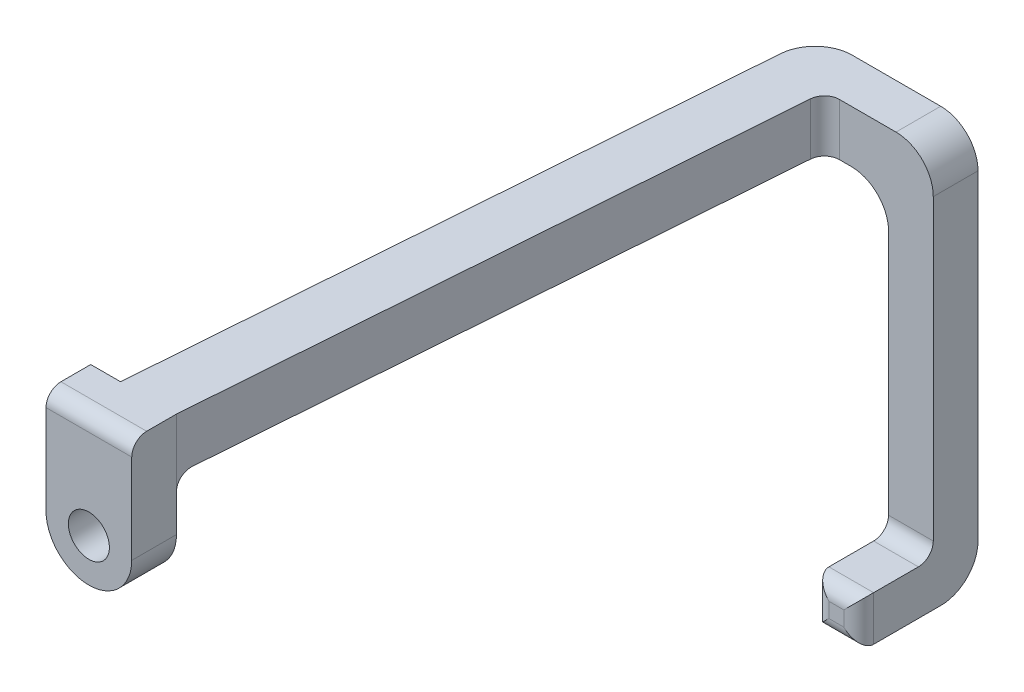
ISO-10303-21;
HEADER;
FILE_DESCRIPTION(('STEP AP214'),'2;1');
FILE_NAME('part.step','',(''),(''),'','','');
FILE_SCHEMA(('AUTOMOTIVE_DESIGN { 1 0 10303 214 1 1 1 1 }'));
ENDSEC;
DATA;
#1=APPLICATION_CONTEXT('core data for automotive mechanical design processes');
#2=APPLICATION_PROTOCOL_DEFINITION('international standard','automotive_design',2000,#1);
#3=PRODUCT_CONTEXT('',#1,'mechanical');
#4=PRODUCT('Part','Part','',(#3));
#5=PRODUCT_RELATED_PRODUCT_CATEGORY('part','',(#4));
#6=PRODUCT_DEFINITION_FORMATION('','',#4);
#7=PRODUCT_DEFINITION_CONTEXT('part definition',#1,'design');
#8=PRODUCT_DEFINITION('design','',#6,#7);
#9=PRODUCT_DEFINITION_SHAPE('','',#8);
#10=(LENGTH_UNIT() NAMED_UNIT(*) SI_UNIT(.MILLI.,.METRE.));
#11=(NAMED_UNIT(*) PLANE_ANGLE_UNIT() SI_UNIT($,.RADIAN.));
#12=(NAMED_UNIT(*) SI_UNIT($,.STERADIAN.) SOLID_ANGLE_UNIT());
#13=UNCERTAINTY_MEASURE_WITH_UNIT(LENGTH_MEASURE(1.E-05),#10,'distance_accuracy_value','');
#14=(GEOMETRIC_REPRESENTATION_CONTEXT(3) GLOBAL_UNCERTAINTY_ASSIGNED_CONTEXT((#13)) GLOBAL_UNIT_ASSIGNED_CONTEXT((#10,
#11,#12)) REPRESENTATION_CONTEXT('',''));
#15=CARTESIAN_POINT('',(0.,0.,0.));
#16=DIRECTION('',(0.,0.,1.));
#17=DIRECTION('',(1.,0.,0.));
#18=AXIS2_PLACEMENT_3D('',#15,#16,#17);
#19=CARTESIAN_POINT('',(1.39673484487678,7.,-40.5));
#20=DIRECTION('',(0.,0.,1.));
#21=DIRECTION('',(1.,0.,0.));
#22=AXIS2_PLACEMENT_3D('',#19,#20,#21);
#23=PLANE('',#22);
#24=DIRECTION('',(1.,0.,0.));
#25=VECTOR('',#24,1.);
#26=CARTESIAN_POINT('',(1.39673484487678,7.,-40.5));
#27=LINE('',#26,#25);
#28=CARTESIAN_POINT('',(6.82893653087128,7.,-40.5));
#29=VERTEX_POINT('',#28);
#30=CARTESIAN_POINT('',(10.625,7.,-40.5));
#31=VERTEX_POINT('',#30);
#32=EDGE_CURVE('E218',#29,#31,#27,.T.);
#33=ORIENTED_EDGE('',*,*,#32,.F.);
#34=DIRECTION('',(0.,-1.,0.));
#35=VECTOR('',#34,1.);
#36=CARTESIAN_POINT('',(6.82893653087128,7.,-40.5));
#37=LINE('',#36,#35);
#38=CARTESIAN_POINT('',(6.82893653087128,3.5,-40.5));
#39=VERTEX_POINT('',#38);
#40=EDGE_CURVE('E371',#29,#39,#37,.T.);
#41=ORIENTED_EDGE('',*,*,#40,.T.);
#42=DIRECTION('',(1.,0.,0.));
#43=VECTOR('',#42,1.);
#44=CARTESIAN_POINT('',(1.39673484487678,3.5,-40.5));
#45=LINE('',#44,#43);
#46=CARTESIAN_POINT('',(7.625,3.5,-40.5));
#47=VERTEX_POINT('',#46);
#48=EDGE_CURVE('E375',#39,#47,#45,.T.);
#49=ORIENTED_EDGE('',*,*,#48,.T.);
#50=CARTESIAN_POINT('',(7.625,0.999999999999999,-40.5));
#51=DIRECTION('',(0.,0.,1.));
#52=DIRECTION('',(1.,0.,0.));
#53=AXIS2_PLACEMENT_3D('',#50,#51,#52);
#54=CIRCLE('',#53,2.5);
#55=CARTESIAN_POINT('',(10.125,0.999999999999997,-40.5));
#56=VERTEX_POINT('',#55);
#57=EDGE_CURVE('E525',#47,#56,#54,.F.);
#58=ORIENTED_EDGE('',*,*,#57,.T.);
#59=DIRECTION('',(0.,1.,0.));
#60=VECTOR('',#59,1.);
#61=CARTESIAN_POINT('',(10.125,-19.5,-40.5));
#62=LINE('',#61,#60);
#63=CARTESIAN_POINT('',(10.125,-15.5,-40.5));
#64=VERTEX_POINT('',#63);
#65=EDGE_CURVE('E471',#64,#56,#62,.T.);
#66=ORIENTED_EDGE('',*,*,#65,.F.);
#67=DIRECTION('',(-1.,0.,0.));
#68=VECTOR('',#67,1.);
#69=CARTESIAN_POINT('',(1.39673484487678,-15.5,-40.5));
#70=LINE('',#69,#68);
#71=CARTESIAN_POINT('',(13.125,-15.5,-40.5));
#72=VERTEX_POINT('',#71);
#73=EDGE_CURVE('E383',#64,#72,#70,.F.);
#74=ORIENTED_EDGE('',*,*,#73,.T.);
#75=DIRECTION('',(0.,-1.,0.));
#76=VECTOR('',#75,1.);
#77=CARTESIAN_POINT('',(13.125,7.,-40.5));
#78=LINE('',#77,#76);
#79=CARTESIAN_POINT('',(13.125,4.5,-40.5));
#80=VERTEX_POINT('',#79);
#81=EDGE_CURVE('E478',#80,#72,#78,.T.);
#82=ORIENTED_EDGE('',*,*,#81,.F.);
#83=CARTESIAN_POINT('',(10.625,4.5,-40.5));
#84=DIRECTION('',(0.,0.,1.));
#85=DIRECTION('',(1.,0.,0.));
#86=AXIS2_PLACEMENT_3D('',#83,#84,#85);
#87=CIRCLE('',#86,2.5);
#88=EDGE_CURVE('E374',#80,#31,#87,.T.);
#89=ORIENTED_EDGE('',*,*,#88,.T.);
#90=EDGE_LOOP('',(#33,#41,#49,#58,#66,#74,#82,#89));
#91=FACE_BOUND('',#90,.T.);
#92=ADVANCED_FACE('F47',(#91),#23,.T.);
#93=CARTESIAN_POINT('',(0.,0.,3.));
#94=DIRECTION('',(0.,0.,1.));
#95=DIRECTION('',(1.,0.,0.));
#96=AXIS2_PLACEMENT_3D('',#93,#94,#95);
#97=PLANE('',#96);
#98=DIRECTION('',(0.,1.,0.));
#99=VECTOR('',#98,1.);
#100=CARTESIAN_POINT('',(2.875,0.,3.));
#101=LINE('',#100,#99);
#102=CARTESIAN_POINT('',(2.875,0.,3.));
#103=VERTEX_POINT('',#102);
#104=CARTESIAN_POINT('',(2.875,6.,3.));
#105=VERTEX_POINT('',#104);
#106=EDGE_CURVE('E276',#103,#105,#101,.T.);
#107=ORIENTED_EDGE('',*,*,#106,.T.);
#108=DIRECTION('',(-1.,0.,0.));
#109=VECTOR('',#108,1.);
#110=CARTESIAN_POINT('',(-2.875,6.,3.));
#111=LINE('',#110,#109);
#112=CARTESIAN_POINT('',(-2.875,6.,3.));
#113=VERTEX_POINT('',#112);
#114=EDGE_CURVE('E385',#105,#113,#111,.T.);
#115=ORIENTED_EDGE('',*,*,#114,.T.);
#116=DIRECTION('',(0.,-1.,0.));
#117=VECTOR('',#116,1.);
#118=CARTESIAN_POINT('',(-2.875,0.,3.));
#119=LINE('',#118,#117);
#120=CARTESIAN_POINT('',(-2.875,0.,3.));
#121=VERTEX_POINT('',#120);
#122=EDGE_CURVE('E280',#113,#121,#119,.T.);
#123=ORIENTED_EDGE('',*,*,#122,.T.);
#124=CARTESIAN_POINT('',(0.,0.,3.));
#125=DIRECTION('',(0.,0.,1.));
#126=DIRECTION('',(1.,0.,0.));
#127=AXIS2_PLACEMENT_3D('',#124,#125,#126);
#128=CIRCLE('',#127,2.875);
#129=EDGE_CURVE('E273',#121,#103,#128,.T.);
#130=ORIENTED_EDGE('',*,*,#129,.T.);
#131=EDGE_LOOP('',(#107,#115,#123,#130));
#132=FACE_BOUND('',#131,.T.);
#133=CARTESIAN_POINT('',(0.,0.,3.));
#134=DIRECTION('',(0.,0.,1.));
#135=DIRECTION('',(1.,0.,0.));
#136=AXIS2_PLACEMENT_3D('',#133,#134,#135);
#137=CIRCLE('',#136,1.375);
#138=CARTESIAN_POINT('',(1.375,0.,3.));
#139=VERTEX_POINT('',#138);
#140=EDGE_CURVE('E262',#139,#139,#137,.T.);
#141=ORIENTED_EDGE('',*,*,#140,.F.);
#142=EDGE_LOOP('',(#141));
#143=FACE_BOUND('',#142,.T.);
#144=ADVANCED_FACE('F359',(#132,#143),#97,.T.);
#145=CARTESIAN_POINT('',(0.,0.,0.));
#146=DIRECTION('',(0.,0.,1.));
#147=DIRECTION('',(1.,0.,0.));
#148=AXIS2_PLACEMENT_3D('',#145,#146,#147);
#149=PLANE('',#148);
#150=DIRECTION('',(0.,1.,0.));
#151=VECTOR('',#150,1.);
#152=CARTESIAN_POINT('',(-0.875,7.,0.));
#153=LINE('',#152,#151);
#154=CARTESIAN_POINT('',(-0.875,2.5,0.));
#155=VERTEX_POINT('',#154);
#156=CARTESIAN_POINT('',(-0.875,7.,0.));
#157=VERTEX_POINT('',#156);
#158=EDGE_CURVE('E65',#155,#157,#153,.T.);
#159=ORIENTED_EDGE('',*,*,#158,.F.);
#160=DIRECTION('',(-1.,0.,0.));
#161=VECTOR('',#160,1.);
#162=CARTESIAN_POINT('',(2.875,2.5,0.));
#163=LINE('',#162,#161);
#164=CARTESIAN_POINT('',(2.875,2.5,0.));
#165=VERTEX_POINT('',#164);
#166=EDGE_CURVE('E422',#155,#165,#163,.F.);
#167=ORIENTED_EDGE('',*,*,#166,.T.);
#168=DIRECTION('',(0.,1.,0.));
#169=VECTOR('',#168,1.);
#170=CARTESIAN_POINT('',(2.875,0.,0.));
#171=LINE('',#170,#169);
#172=CARTESIAN_POINT('',(2.875,0.,0.));
#173=VERTEX_POINT('',#172);
#174=EDGE_CURVE('E285',#173,#165,#171,.T.);
#175=ORIENTED_EDGE('',*,*,#174,.F.);
#176=CARTESIAN_POINT('',(0.,0.,0.));
#177=DIRECTION('',(0.,0.,1.));
#178=DIRECTION('',(1.,0.,0.));
#179=AXIS2_PLACEMENT_3D('',#176,#177,#178);
#180=CIRCLE('',#179,2.875);
#181=CARTESIAN_POINT('',(-2.875,0.,0.));
#182=VERTEX_POINT('',#181);
#183=EDGE_CURVE('E270',#182,#173,#180,.T.);
#184=ORIENTED_EDGE('',*,*,#183,.F.);
#185=DIRECTION('',(0.,-1.,0.));
#186=VECTOR('',#185,1.);
#187=CARTESIAN_POINT('',(-2.875,0.,0.));
#188=LINE('',#187,#186);
#189=CARTESIAN_POINT('',(-2.875,7.,0.));
#190=VERTEX_POINT('',#189);
#191=EDGE_CURVE('E277',#190,#182,#188,.T.);
#192=ORIENTED_EDGE('',*,*,#191,.F.);
#193=DIRECTION('',(-1.,0.,0.));
#194=VECTOR('',#193,1.);
#195=CARTESIAN_POINT('',(2.875,7.,0.));
#196=LINE('',#195,#194);
#197=EDGE_CURVE('E294',#157,#190,#196,.T.);
#198=ORIENTED_EDGE('',*,*,#197,.F.);
#199=EDGE_LOOP('',(#159,#167,#175,#184,#192,#198));
#200=FACE_BOUND('',#199,.T.);
#201=CARTESIAN_POINT('',(0.,0.,0.));
#202=DIRECTION('',(0.,0.,1.));
#203=DIRECTION('',(1.,0.,0.));
#204=AXIS2_PLACEMENT_3D('',#201,#202,#203);
#205=CIRCLE('',#204,1.375);
#206=CARTESIAN_POINT('',(1.375,0.,0.));
#207=VERTEX_POINT('',#206);
#208=EDGE_CURVE('E228',#207,#207,#205,.T.);
#209=ORIENTED_EDGE('',*,*,#208,.T.);
#210=EDGE_LOOP('',(#209));
#211=FACE_BOUND('',#210,.T.);
#212=ADVANCED_FACE('F365',(#200,#211),#149,.F.);
#213=CARTESIAN_POINT('',(0.,0.,3.));
#214=DIRECTION('',(0.,0.,-1.));
#215=DIRECTION('',(-1.,0.,0.));
#216=AXIS2_PLACEMENT_3D('',#213,#214,#215);
#217=CYLINDRICAL_SURFACE('',#216,2.875);
#218=ORIENTED_EDGE('',*,*,#183,.T.);
#219=DIRECTION('',(0.,0.,-1.));
#220=VECTOR('',#219,1.);
#221=CARTESIAN_POINT('',(2.875,0.,3.));
#222=LINE('',#221,#220);
#223=EDGE_CURVE('E303',#103,#173,#222,.T.);
#224=ORIENTED_EDGE('',*,*,#223,.F.);
#225=ORIENTED_EDGE('',*,*,#129,.F.);
#226=DIRECTION('',(0.,0.,-1.));
#227=VECTOR('',#226,1.);
#228=CARTESIAN_POINT('',(-2.875,0.,3.));
#229=LINE('',#228,#227);
#230=EDGE_CURVE('E282',#121,#182,#229,.T.);
#231=ORIENTED_EDGE('',*,*,#230,.T.);
#232=EDGE_LOOP('',(#218,#224,#225,#231));
#233=FACE_BOUND('',#232,.T.);
#234=ADVANCED_FACE('F415',(#233),#217,.T.);
#235=CARTESIAN_POINT('',(2.875,0.,3.));
#236=DIRECTION('',(-1.,0.,0.));
#237=DIRECTION('',(0.,-1.,0.));
#238=AXIS2_PLACEMENT_3D('',#235,#236,#237);
#239=PLANE('',#238);
#240=DIRECTION('',(0.,0.,-1.));
#241=VECTOR('',#240,1.);
#242=CARTESIAN_POINT('',(2.875,7.,3.));
#243=LINE('',#242,#241);
#244=CARTESIAN_POINT('',(2.875,7.,2.));
#245=VERTEX_POINT('',#244);
#246=CARTESIAN_POINT('',(2.875,7.,0.));
#247=VERTEX_POINT('',#246);
#248=EDGE_CURVE('E300',#245,#247,#243,.T.);
#249=ORIENTED_EDGE('',*,*,#248,.F.);
#250=CARTESIAN_POINT('',(2.875,6.,2.));
#251=DIRECTION('',(-1.,0.,0.));
#252=DIRECTION('',(0.,-1.,0.));
#253=AXIS2_PLACEMENT_3D('',#250,#251,#252);
#254=CIRCLE('',#253,1.);
#255=EDGE_CURVE('E309',#245,#105,#254,.F.);
#256=ORIENTED_EDGE('',*,*,#255,.T.);
#257=ORIENTED_EDGE('',*,*,#106,.F.);
#258=ORIENTED_EDGE('',*,*,#223,.T.);
#259=ORIENTED_EDGE('',*,*,#174,.T.);
#260=DIRECTION('',(0.,-1.,0.));
#261=VECTOR('',#260,1.);
#262=CARTESIAN_POINT('',(2.875,3.5,0.));
#263=LINE('',#262,#261);
#264=EDGE_CURVE('E425',#247,#165,#263,.T.);
#265=ORIENTED_EDGE('',*,*,#264,.F.);
#266=EDGE_LOOP('',(#249,#256,#257,#258,#259,#265));
#267=FACE_BOUND('',#266,.T.);
#268=ADVANCED_FACE('F407',(#267),#239,.F.);
#269=CARTESIAN_POINT('',(2.875,7.,3.));
#270=DIRECTION('',(0.,-1.,0.));
#271=DIRECTION('',(0.,0.,-1.));
#272=AXIS2_PLACEMENT_3D('',#269,#270,#271);
#273=PLANE('',#272);
#274=DIRECTION('',(0.,0.,-1.));
#275=VECTOR('',#274,1.);
#276=CARTESIAN_POINT('',(-2.875,7.,3.));
#277=LINE('',#276,#275);
#278=CARTESIAN_POINT('',(-2.875,7.,2.));
#279=VERTEX_POINT('',#278);
#280=EDGE_CURVE('E304',#279,#190,#277,.T.);
#281=ORIENTED_EDGE('',*,*,#280,.F.);
#282=DIRECTION('',(-1.,0.,0.));
#283=VECTOR('',#282,1.);
#284=CARTESIAN_POINT('',(2.875,7.,2.));
#285=LINE('',#284,#283);
#286=EDGE_CURVE('E307',#279,#245,#285,.F.);
#287=ORIENTED_EDGE('',*,*,#286,.T.);
#288=ORIENTED_EDGE('',*,*,#248,.T.);
#289=DIRECTION('',(0.0745049904033776,0.,-0.99722064078367));
#290=VECTOR('',#289,1.);
#291=CARTESIAN_POINT('',(2.875,7.,0.));
#292=LINE('',#291,#290);
#293=CARTESIAN_POINT('',(5.83171589008761,7.,-39.5745049904034));
#294=VERTEX_POINT('',#293);
#295=EDGE_CURVE('E325',#247,#294,#292,.T.);
#296=ORIENTED_EDGE('',*,*,#295,.T.);
#297=CARTESIAN_POINT('',(6.82893653087128,7.,-39.5));
#298=DIRECTION('',(0.,-1.,0.));
#299=DIRECTION('',(0.,0.,-1.));
#300=AXIS2_PLACEMENT_3D('',#297,#298,#299);
#301=CIRCLE('',#300,1.);
#302=EDGE_CURVE('E380',#294,#29,#301,.T.);
#303=ORIENTED_EDGE('',*,*,#302,.T.);
#304=ORIENTED_EDGE('',*,*,#32,.T.);
#305=DIRECTION('',(0.,0.,1.));
#306=VECTOR('',#305,1.);
#307=CARTESIAN_POINT('',(10.625,7.,-43.5));
#308=LINE('',#307,#306);
#309=CARTESIAN_POINT('',(10.625,7.,-43.5));
#310=VERTEX_POINT('',#309);
#311=EDGE_CURVE('E215',#31,#310,#308,.F.);
#312=ORIENTED_EDGE('',*,*,#311,.T.);
#313=DIRECTION('',(-1.,0.,0.));
#314=VECTOR('',#313,1.);
#315=CARTESIAN_POINT('',(13.125,7.,-43.5));
#316=LINE('',#315,#314);
#317=CARTESIAN_POINT('',(6.125,7.,-43.5));
#318=VERTEX_POINT('',#317);
#319=EDGE_CURVE('E208',#310,#318,#316,.T.);
#320=ORIENTED_EDGE('',*,*,#319,.T.);
#321=DIRECTION('',(1.,0.,0.));
#322=VECTOR('',#321,1.);
#323=CARTESIAN_POINT('',(6.125,7.,-43.5));
#324=LINE('',#323,#322);
#325=CARTESIAN_POINT('',(4.6951861547644,7.,-43.5));
#326=VERTEX_POINT('',#325);
#327=EDGE_CURVE('E212',#326,#318,#324,.T.);
#328=ORIENTED_EDGE('',*,*,#327,.F.);
#329=CARTESIAN_POINT('',(4.6951861547644,7.,-41.));
#330=DIRECTION('',(0.,-1.,0.));
#331=DIRECTION('',(0.,0.,-1.));
#332=AXIS2_PLACEMENT_3D('',#329,#330,#331);
#333=CIRCLE('',#332,2.5);
#334=CARTESIAN_POINT('',(2.20213455280523,7.,-41.1862624760084));
#335=VERTEX_POINT('',#334);
#336=EDGE_CURVE('E511',#326,#335,#333,.F.);
#337=ORIENTED_EDGE('',*,*,#336,.T.);
#338=DIRECTION('',(0.0745049904033776,0.,-0.99722064078367));
#339=VECTOR('',#338,1.);
#340=CARTESIAN_POINT('',(-0.875,7.,0.));
#341=LINE('',#340,#339);
#342=EDGE_CURVE('E322',#157,#335,#341,.T.);
#343=ORIENTED_EDGE('',*,*,#342,.F.);
#344=ORIENTED_EDGE('',*,*,#197,.T.);
#345=EDGE_LOOP('',(#281,#287,#288,#296,#303,#304,#312,#320,#328,#337,#343,#344));
#346=FACE_BOUND('',#345,.T.);
#347=ADVANCED_FACE('F211',(#346),#273,.F.);
#348=CARTESIAN_POINT('',(-2.875,0.,3.));
#349=DIRECTION('',(1.,0.,0.));
#350=DIRECTION('',(0.,1.,0.));
#351=AXIS2_PLACEMENT_3D('',#348,#349,#350);
#352=PLANE('',#351);
#353=ORIENTED_EDGE('',*,*,#122,.F.);
#354=CARTESIAN_POINT('',(-2.875,6.,2.));
#355=DIRECTION('',(1.,0.,0.));
#356=DIRECTION('',(0.,1.,0.));
#357=AXIS2_PLACEMENT_3D('',#354,#355,#356);
#358=CIRCLE('',#357,1.);
#359=EDGE_CURVE('E305',#113,#279,#358,.F.);
#360=ORIENTED_EDGE('',*,*,#359,.T.);
#361=ORIENTED_EDGE('',*,*,#280,.T.);
#362=ORIENTED_EDGE('',*,*,#191,.T.);
#363=ORIENTED_EDGE('',*,*,#230,.F.);
#364=EDGE_LOOP('',(#353,#360,#361,#362,#363));
#365=FACE_BOUND('',#364,.T.);
#366=ADVANCED_FACE('F395',(#365),#352,.F.);
#367=CARTESIAN_POINT('',(0.,0.,3.));
#368=DIRECTION('',(0.,0.,-1.));
#369=DIRECTION('',(-1.,0.,0.));
#370=AXIS2_PLACEMENT_3D('',#367,#368,#369);
#371=CYLINDRICAL_SURFACE('',#370,1.375);
#372=ORIENTED_EDGE('',*,*,#140,.T.);
#373=EDGE_LOOP('',(#372));
#374=FACE_BOUND('',#373,.T.);
#375=ORIENTED_EDGE('',*,*,#208,.F.);
#376=EDGE_LOOP('',(#375));
#377=FACE_BOUND('',#376,.T.);
#378=ADVANCED_FACE('F254',(#374,#377),#371,.F.);
#379=CARTESIAN_POINT('',(0.,0.,-43.5));
#380=DIRECTION('',(0.,0.,1.));
#381=DIRECTION('',(1.,0.,0.));
#382=AXIS2_PLACEMENT_3D('',#379,#380,#381);
#383=PLANE('',#382);
#384=DIRECTION('',(0.,1.,0.));
#385=VECTOR('',#384,1.);
#386=CARTESIAN_POINT('',(13.125,7.,-43.5));
#387=LINE('',#386,#385);
#388=CARTESIAN_POINT('',(13.125,-17.,-43.5));
#389=VERTEX_POINT('',#388);
#390=CARTESIAN_POINT('',(13.125,4.5,-43.5));
#391=VERTEX_POINT('',#390);
#392=EDGE_CURVE('E473',#389,#391,#387,.T.);
#393=ORIENTED_EDGE('',*,*,#392,.F.);
#394=DIRECTION('',(-1.,0.,0.));
#395=VECTOR('',#394,1.);
#396=CARTESIAN_POINT('',(0.,-17.,-43.5));
#397=LINE('',#396,#395);
#398=CARTESIAN_POINT('',(10.125,-17.,-43.5));
#399=VERTEX_POINT('',#398);
#400=EDGE_CURVE('E493',#389,#399,#397,.T.);
#401=ORIENTED_EDGE('',*,*,#400,.T.);
#402=DIRECTION('',(0.,1.,0.));
#403=VECTOR('',#402,1.);
#404=CARTESIAN_POINT('',(10.125,-19.5,-43.5));
#405=LINE('',#404,#403);
#406=CARTESIAN_POINT('',(10.125,0.999999999999997,-43.5));
#407=VERTEX_POINT('',#406);
#408=EDGE_CURVE('E470',#399,#407,#405,.T.);
#409=ORIENTED_EDGE('',*,*,#408,.T.);
#410=CARTESIAN_POINT('',(7.625,0.999999999999999,-43.5));
#411=DIRECTION('',(0.,0.,1.));
#412=DIRECTION('',(1.,0.,0.));
#413=AXIS2_PLACEMENT_3D('',#410,#411,#412);
#414=CIRCLE('',#413,2.5);
#415=CARTESIAN_POINT('',(7.625,3.5,-43.5));
#416=VERTEX_POINT('',#415);
#417=EDGE_CURVE('E527',#407,#416,#414,.T.);
#418=ORIENTED_EDGE('',*,*,#417,.T.);
#419=DIRECTION('',(-1.,0.,0.));
#420=VECTOR('',#419,1.);
#421=CARTESIAN_POINT('',(13.125,3.5,-43.5));
#422=LINE('',#421,#420);
#423=CARTESIAN_POINT('',(6.125,3.5,-43.5));
#424=VERTEX_POINT('',#423);
#425=EDGE_CURVE('E219',#416,#424,#422,.T.);
#426=ORIENTED_EDGE('',*,*,#425,.T.);
#427=DIRECTION('',(-1.,0.,0.));
#428=VECTOR('',#427,1.);
#429=CARTESIAN_POINT('',(2.375,3.5,-43.5));
#430=LINE('',#429,#428);
#431=CARTESIAN_POINT('',(4.6951861547644,3.5,-43.5));
#432=VERTEX_POINT('',#431);
#433=EDGE_CURVE('E229',#424,#432,#430,.T.);
#434=ORIENTED_EDGE('',*,*,#433,.T.);
#435=DIRECTION('',(0.,1.,0.));
#436=VECTOR('',#435,1.);
#437=CARTESIAN_POINT('',(4.6951861547644,0.,-43.5));
#438=LINE('',#437,#436);
#439=EDGE_CURVE('E227',#432,#326,#438,.T.);
#440=ORIENTED_EDGE('',*,*,#439,.T.);
#441=ORIENTED_EDGE('',*,*,#327,.T.);
#442=ORIENTED_EDGE('',*,*,#319,.F.);
#443=CARTESIAN_POINT('',(10.625,4.5,-43.5));
#444=DIRECTION('',(0.,0.,1.));
#445=DIRECTION('',(1.,0.,0.));
#446=AXIS2_PLACEMENT_3D('',#443,#444,#445);
#447=CIRCLE('',#446,2.5);
#448=EDGE_CURVE('E417',#310,#391,#447,.F.);
#449=ORIENTED_EDGE('',*,*,#448,.T.);
#450=EDGE_LOOP('',(#393,#401,#409,#418,#426,#434,#440,#441,#442,#449));
#451=FACE_BOUND('',#450,.T.);
#452=ADVANCED_FACE('F224',(#451),#383,.F.);
#453=CARTESIAN_POINT('',(0.,3.5,0.));
#454=DIRECTION('',(0.,1.,0.));
#455=DIRECTION('',(-1.,0.,0.));
#456=AXIS2_PLACEMENT_3D('',#453,#454,#455);
#457=PLANE('',#456);
#458=DIRECTION('',(0.0745049904033776,0.,-0.99722064078367));
#459=VECTOR('',#458,1.);
#460=CARTESIAN_POINT('',(2.875,3.5,0.));
#461=LINE('',#460,#459);
#462=CARTESIAN_POINT('',(2.94971264367816,3.5,-1.));
#463=VERTEX_POINT('',#462);
#464=CARTESIAN_POINT('',(5.83171589008761,3.5,-39.5745049904034));
#465=VERTEX_POINT('',#464);
#466=EDGE_CURVE('E315',#463,#465,#461,.T.);
#467=ORIENTED_EDGE('',*,*,#466,.F.);
#468=DIRECTION('',(-1.,0.,0.));
#469=VECTOR('',#468,1.);
#470=CARTESIAN_POINT('',(-0.875,3.5,-1.));
#471=LINE('',#470,#469);
#472=CARTESIAN_POINT('',(-0.800287356321839,3.5,-1.));
#473=VERTEX_POINT('',#472);
#474=EDGE_CURVE('E311',#463,#473,#471,.T.);
#475=ORIENTED_EDGE('',*,*,#474,.T.);
#476=DIRECTION('',(0.0745049904033776,0.,-0.99722064078367));
#477=VECTOR('',#476,1.);
#478=CARTESIAN_POINT('',(-0.875,3.5,0.));
#479=LINE('',#478,#477);
#480=CARTESIAN_POINT('',(2.20213455280523,3.5,-41.1862624760084));
#481=VERTEX_POINT('',#480);
#482=EDGE_CURVE('E312',#473,#481,#479,.T.);
#483=ORIENTED_EDGE('',*,*,#482,.T.);
#484=CARTESIAN_POINT('',(4.6951861547644,3.5,-41.));
#485=DIRECTION('',(0.,1.,0.));
#486=DIRECTION('',(-1.,0.,0.));
#487=AXIS2_PLACEMENT_3D('',#484,#485,#486);
#488=CIRCLE('',#487,2.5);
#489=EDGE_CURVE('E520',#481,#432,#488,.F.);
#490=ORIENTED_EDGE('',*,*,#489,.T.);
#491=ORIENTED_EDGE('',*,*,#433,.F.);
#492=ORIENTED_EDGE('',*,*,#425,.F.);
#493=DIRECTION('',(0.,0.,1.));
#494=VECTOR('',#493,1.);
#495=CARTESIAN_POINT('',(7.62500000000002,3.5,0.));
#496=LINE('',#495,#494);
#497=EDGE_CURVE('E518',#416,#47,#496,.T.);
#498=ORIENTED_EDGE('',*,*,#497,.T.);
#499=ORIENTED_EDGE('',*,*,#48,.F.);
#500=CARTESIAN_POINT('',(6.82893653087128,3.5,-39.5));
#501=DIRECTION('',(0.,1.,0.));
#502=DIRECTION('',(-1.,0.,0.));
#503=AXIS2_PLACEMENT_3D('',#500,#501,#502);
#504=CIRCLE('',#503,1.);
#505=EDGE_CURVE('E381',#39,#465,#504,.T.);
#506=ORIENTED_EDGE('',*,*,#505,.T.);
#507=EDGE_LOOP('',(#467,#475,#483,#490,#491,#492,#498,#499,#506));
#508=FACE_BOUND('',#507,.T.);
#509=ADVANCED_FACE('F253',(#508),#457,.F.);
#510=CARTESIAN_POINT('',(2.85904089341435,0.,0.213606503530958));
#511=DIRECTION('',(-0.99722064078367,0.,-0.0745049904033776));
#512=DIRECTION('',(-0.0745049904033776,0.,0.99722064078367));
#513=AXIS2_PLACEMENT_3D('',#510,#511,#512);
#514=PLANE('',#513);
#515=ORIENTED_EDGE('',*,*,#466,.T.);
#516=DIRECTION('',(0.,-1.,0.));
#517=VECTOR('',#516,1.);
#518=CARTESIAN_POINT('',(5.83171589008761,0.,-39.5745049904034));
#519=LINE('',#518,#517);
#520=EDGE_CURVE('E382',#465,#294,#519,.F.);
#521=ORIENTED_EDGE('',*,*,#520,.T.);
#522=ORIENTED_EDGE('',*,*,#295,.F.);
#523=ORIENTED_EDGE('',*,*,#264,.T.);
#524=CARTESIAN_POINT('',(2.94971264367816,2.5,-1.));
#525=DIRECTION('',(-0.99722064078367,0.,-0.0745049904033776));
#526=DIRECTION('',(0.0745049904033776,0.,-0.99722064078367));
#527=AXIS2_PLACEMENT_3D('',#524,#525,#526);
#528=ELLIPSE('',#527,1.00278710558392,1.);
#529=EDGE_CURVE('E12',#165,#463,#528,.T.);
#530=ORIENTED_EDGE('',*,*,#529,.T.);
#531=EDGE_LOOP('',(#515,#521,#522,#523,#530));
#532=FACE_BOUND('',#531,.T.);
#533=ADVANCED_FACE('F348',(#532),#514,.F.);
#534=CARTESIAN_POINT('',(-0.87014288060437,0.,-0.0650106749876829));
#535=DIRECTION('',(0.99722064078367,0.,0.0745049904033776));
#536=DIRECTION('',(0.0745049904033776,0.,-0.99722064078367));
#537=AXIS2_PLACEMENT_3D('',#534,#535,#536);
#538=PLANE('',#537);
#539=ORIENTED_EDGE('',*,*,#342,.T.);
#540=DIRECTION('',(0.,1.,0.));
#541=VECTOR('',#540,1.);
#542=CARTESIAN_POINT('',(2.20213455280523,0.,-41.1862624760084));
#543=LINE('',#542,#541);
#544=EDGE_CURVE('E513',#335,#481,#543,.F.);
#545=ORIENTED_EDGE('',*,*,#544,.T.);
#546=ORIENTED_EDGE('',*,*,#482,.F.);
#547=CARTESIAN_POINT('',(-0.80028735632184,2.5,-1.));
#548=DIRECTION('',(0.99722064078367,0.,0.0745049904033776));
#549=DIRECTION('',(0.0745049904033776,0.,-0.99722064078367));
#550=AXIS2_PLACEMENT_3D('',#547,#548,#549);
#551=ELLIPSE('',#550,1.00278710558392,1.);
#552=EDGE_CURVE('E57',#473,#155,#551,.T.);
#553=ORIENTED_EDGE('',*,*,#552,.T.);
#554=ORIENTED_EDGE('',*,*,#158,.T.);
#555=EDGE_LOOP('',(#539,#545,#546,#553,#554));
#556=FACE_BOUND('',#555,.T.);
#557=ADVANCED_FACE('F255',(#556),#538,.F.);
#558=CARTESIAN_POINT('',(13.125,0.,0.));
#559=DIRECTION('',(1.,0.,0.));
#560=DIRECTION('',(0.,0.,-1.));
#561=AXIS2_PLACEMENT_3D('',#558,#559,#560);
#562=PLANE('',#561);
#563=DIRECTION('',(0.,0.,-1.));
#564=VECTOR('',#563,1.);
#565=CARTESIAN_POINT('',(13.125,-16.5,-35.5));
#566=LINE('',#565,#564);
#567=CARTESIAN_POINT('',(13.125,-16.5,-36.5));
#568=VERTEX_POINT('',#567);
#569=CARTESIAN_POINT('',(13.125,-16.5,-39.5));
#570=VERTEX_POINT('',#569);
#571=EDGE_CURVE('E457',#568,#570,#566,.T.);
#572=ORIENTED_EDGE('',*,*,#571,.F.);
#573=DIRECTION('',(0.,1.,0.));
#574=VECTOR('',#573,1.);
#575=CARTESIAN_POINT('',(13.125,-19.5,-36.5));
#576=LINE('',#575,#574);
#577=CARTESIAN_POINT('',(13.125,-19.5,-36.5));
#578=VERTEX_POINT('',#577);
#579=EDGE_CURVE('E546',#568,#578,#576,.F.);
#580=ORIENTED_EDGE('',*,*,#579,.T.);
#581=DIRECTION('',(0.,0.,-1.));
#582=VECTOR('',#581,1.);
#583=CARTESIAN_POINT('',(13.125,-19.5,0.));
#584=LINE('',#583,#582);
#585=CARTESIAN_POINT('',(13.125,-19.5,-41.));
#586=VERTEX_POINT('',#585);
#587=EDGE_CURVE('E463',#578,#586,#584,.T.);
#588=ORIENTED_EDGE('',*,*,#587,.T.);
#589=CARTESIAN_POINT('',(13.125,-17.,-41.));
#590=DIRECTION('',(1.,0.,0.));
#591=DIRECTION('',(0.,0.,-1.));
#592=AXIS2_PLACEMENT_3D('',#589,#590,#591);
#593=CIRCLE('',#592,2.5);
#594=EDGE_CURVE('E508',#586,#389,#593,.T.);
#595=ORIENTED_EDGE('',*,*,#594,.T.);
#596=ORIENTED_EDGE('',*,*,#392,.T.);
#597=DIRECTION('',(0.,0.,1.));
#598=VECTOR('',#597,1.);
#599=CARTESIAN_POINT('',(13.125,4.5,-40.5));
#600=LINE('',#599,#598);
#601=EDGE_CURVE('E505',#391,#80,#600,.T.);
#602=ORIENTED_EDGE('',*,*,#601,.T.);
#603=ORIENTED_EDGE('',*,*,#81,.T.);
#604=CARTESIAN_POINT('',(13.125,-15.5,-39.5));
#605=DIRECTION('',(1.,0.,0.));
#606=DIRECTION('',(0.,0.,-1.));
#607=AXIS2_PLACEMENT_3D('',#604,#605,#606);
#608=CIRCLE('',#607,1.);
#609=EDGE_CURVE('E438',#72,#570,#608,.F.);
#610=ORIENTED_EDGE('',*,*,#609,.T.);
#611=EDGE_LOOP('',(#572,#580,#588,#595,#596,#602,#603,#610));
#612=FACE_BOUND('',#611,.T.);
#613=ADVANCED_FACE('F355',(#612),#562,.T.);
#614=CARTESIAN_POINT('',(10.125,-19.5,0.));
#615=DIRECTION('',(-1.,0.,0.));
#616=DIRECTION('',(0.,0.,1.));
#617=AXIS2_PLACEMENT_3D('',#614,#615,#616);
#618=PLANE('',#617);
#619=DIRECTION('',(0.,0.,1.));
#620=VECTOR('',#619,1.);
#621=CARTESIAN_POINT('',(10.125,-19.5,0.));
#622=LINE('',#621,#620);
#623=CARTESIAN_POINT('',(10.125,-19.5,-41.));
#624=VERTEX_POINT('',#623);
#625=CARTESIAN_POINT('',(10.125,-19.5,-36.5));
#626=VERTEX_POINT('',#625);
#627=EDGE_CURVE('E467',#624,#626,#622,.T.);
#628=ORIENTED_EDGE('',*,*,#627,.T.);
#629=DIRECTION('',(0.,-1.,0.));
#630=VECTOR('',#629,1.);
#631=CARTESIAN_POINT('',(10.125,-16.5,-36.5));
#632=LINE('',#631,#630);
#633=CARTESIAN_POINT('',(10.125,-16.5,-36.5));
#634=VERTEX_POINT('',#633);
#635=EDGE_CURVE('E539',#626,#634,#632,.F.);
#636=ORIENTED_EDGE('',*,*,#635,.T.);
#637=DIRECTION('',(0.,0.,-1.));
#638=VECTOR('',#637,1.);
#639=CARTESIAN_POINT('',(10.125,-16.5,-35.5));
#640=LINE('',#639,#638);
#641=CARTESIAN_POINT('',(10.125,-16.5,-39.5));
#642=VERTEX_POINT('',#641);
#643=EDGE_CURVE('E451',#634,#642,#640,.T.);
#644=ORIENTED_EDGE('',*,*,#643,.T.);
#645=CARTESIAN_POINT('',(10.125,-15.5,-39.5));
#646=DIRECTION('',(-1.,0.,0.));
#647=DIRECTION('',(0.,0.,1.));
#648=AXIS2_PLACEMENT_3D('',#645,#646,#647);
#649=CIRCLE('',#648,1.);
#650=EDGE_CURVE('E434',#642,#64,#649,.F.);
#651=ORIENTED_EDGE('',*,*,#650,.T.);
#652=ORIENTED_EDGE('',*,*,#65,.T.);
#653=DIRECTION('',(0.,0.,1.));
#654=VECTOR('',#653,1.);
#655=CARTESIAN_POINT('',(10.125,0.999999999999997,0.));
#656=LINE('',#655,#654);
#657=EDGE_CURVE('E498',#56,#407,#656,.F.);
#658=ORIENTED_EDGE('',*,*,#657,.T.);
#659=ORIENTED_EDGE('',*,*,#408,.F.);
#660=CARTESIAN_POINT('',(10.125,-17.,-41.));
#661=DIRECTION('',(-1.,0.,0.));
#662=DIRECTION('',(0.,0.,1.));
#663=AXIS2_PLACEMENT_3D('',#660,#661,#662);
#664=CIRCLE('',#663,2.5);
#665=EDGE_CURVE('E500',#399,#624,#664,.T.);
#666=ORIENTED_EDGE('',*,*,#665,.T.);
#667=EDGE_LOOP('',(#628,#636,#644,#651,#652,#658,#659,#666));
#668=FACE_BOUND('',#667,.T.);
#669=ADVANCED_FACE('F554',(#668),#618,.T.);
#670=CARTESIAN_POINT('',(0.,-19.5,0.));
#671=DIRECTION('',(0.,1.,0.));
#672=DIRECTION('',(-1.,0.,0.));
#673=AXIS2_PLACEMENT_3D('',#670,#671,#672);
#674=PLANE('',#673);
#675=ORIENTED_EDGE('',*,*,#587,.F.);
#676=DIRECTION('',(1.,0.,0.));
#677=VECTOR('',#676,1.);
#678=CARTESIAN_POINT('',(0.,-19.5,-36.5));
#679=LINE('',#678,#677);
#680=EDGE_CURVE('E387',#578,#626,#679,.F.);
#681=ORIENTED_EDGE('',*,*,#680,.T.);
#682=ORIENTED_EDGE('',*,*,#627,.F.);
#683=DIRECTION('',(-1.,0.,0.));
#684=VECTOR('',#683,1.);
#685=CARTESIAN_POINT('',(0.,-19.5,-41.));
#686=LINE('',#685,#684);
#687=EDGE_CURVE('E502',#624,#586,#686,.F.);
#688=ORIENTED_EDGE('',*,*,#687,.T.);
#689=EDGE_LOOP('',(#675,#681,#682,#688));
#690=FACE_BOUND('',#689,.T.);
#691=ADVANCED_FACE('F550',(#690),#674,.F.);
#692=CARTESIAN_POINT('',(13.125,-16.5,-35.5));
#693=DIRECTION('',(0.,-1.,0.));
#694=DIRECTION('',(0.,0.,-1.));
#695=AXIS2_PLACEMENT_3D('',#692,#693,#694);
#696=PLANE('',#695);
#697=ORIENTED_EDGE('',*,*,#643,.F.);
#698=DIRECTION('',(-1.,0.,0.));
#699=VECTOR('',#698,1.);
#700=CARTESIAN_POINT('',(13.125,-16.5,-36.5));
#701=LINE('',#700,#699);
#702=EDGE_CURVE('E544',#634,#568,#701,.F.);
#703=ORIENTED_EDGE('',*,*,#702,.T.);
#704=ORIENTED_EDGE('',*,*,#571,.T.);
#705=DIRECTION('',(-1.,0.,0.));
#706=VECTOR('',#705,1.);
#707=CARTESIAN_POINT('',(13.125,-16.5,-39.5));
#708=LINE('',#707,#706);
#709=EDGE_CURVE('E541',#570,#642,#708,.T.);
#710=ORIENTED_EDGE('',*,*,#709,.T.);
#711=EDGE_LOOP('',(#697,#703,#704,#710));
#712=FACE_BOUND('',#711,.T.);
#713=ADVANCED_FACE('F567',(#712),#696,.F.);
#714=CARTESIAN_POINT('',(0.,0.,-35.5));
#715=DIRECTION('',(0.,0.,-1.));
#716=DIRECTION('',(-1.,0.,0.));
#717=AXIS2_PLACEMENT_3D('',#714,#715,#716);
#718=PLANE('',#717);
#719=DIRECTION('',(-1.,0.,0.));
#720=VECTOR('',#719,1.);
#721=CARTESIAN_POINT('',(0.,-17.5,-35.5));
#722=LINE('',#721,#720);
#723=CARTESIAN_POINT('',(12.125,-17.5,-35.5));
#724=VERTEX_POINT('',#723);
#725=CARTESIAN_POINT('',(11.125,-17.5,-35.5));
#726=VERTEX_POINT('',#725);
#727=EDGE_CURVE('E534',#724,#726,#722,.T.);
#728=ORIENTED_EDGE('',*,*,#727,.T.);
#729=DIRECTION('',(0.,-1.,0.));
#730=VECTOR('',#729,1.);
#731=CARTESIAN_POINT('',(11.125,-19.5,-35.5));
#732=LINE('',#731,#730);
#733=CARTESIAN_POINT('',(11.125,-18.5,-35.5));
#734=VERTEX_POINT('',#733);
#735=EDGE_CURVE('E536',#726,#734,#732,.T.);
#736=ORIENTED_EDGE('',*,*,#735,.T.);
#737=DIRECTION('',(1.,0.,0.));
#738=VECTOR('',#737,1.);
#739=CARTESIAN_POINT('',(0.,-18.5,-35.5));
#740=LINE('',#739,#738);
#741=CARTESIAN_POINT('',(12.125,-18.5,-35.5));
#742=VERTEX_POINT('',#741);
#743=EDGE_CURVE('E528',#734,#742,#740,.T.);
#744=ORIENTED_EDGE('',*,*,#743,.T.);
#745=DIRECTION('',(0.,1.,0.));
#746=VECTOR('',#745,1.);
#747=CARTESIAN_POINT('',(12.125,-16.5,-35.5));
#748=LINE('',#747,#746);
#749=EDGE_CURVE('E532',#742,#724,#748,.T.);
#750=ORIENTED_EDGE('',*,*,#749,.T.);
#751=EDGE_LOOP('',(#728,#736,#744,#750));
#752=FACE_BOUND('',#751,.T.);
#753=ADVANCED_FACE('F563',(#752),#718,.F.);
#754=CARTESIAN_POINT('',(0.,-17.,-41.));
#755=DIRECTION('',(-1.,0.,0.));
#756=DIRECTION('',(0.,-1.,0.));
#757=AXIS2_PLACEMENT_3D('',#754,#755,#756);
#758=CYLINDRICAL_SURFACE('',#757,2.5);
#759=ORIENTED_EDGE('',*,*,#594,.F.);
#760=ORIENTED_EDGE('',*,*,#687,.F.);
#761=ORIENTED_EDGE('',*,*,#665,.F.);
#762=ORIENTED_EDGE('',*,*,#400,.F.);
#763=EDGE_LOOP('',(#759,#760,#761,#762));
#764=FACE_BOUND('',#763,.T.);
#765=ADVANCED_FACE('F665',(#764),#758,.T.);
#766=CARTESIAN_POINT('',(4.6951861547644,0.,-41.));
#767=DIRECTION('',(0.,1.,0.));
#768=DIRECTION('',(-1.,0.,0.));
#769=AXIS2_PLACEMENT_3D('',#766,#767,#768);
#770=CYLINDRICAL_SURFACE('',#769,2.5);
#771=ORIENTED_EDGE('',*,*,#489,.F.);
#772=ORIENTED_EDGE('',*,*,#544,.F.);
#773=ORIENTED_EDGE('',*,*,#336,.F.);
#774=ORIENTED_EDGE('',*,*,#439,.F.);
#775=EDGE_LOOP('',(#771,#772,#773,#774));
#776=FACE_BOUND('',#775,.T.);
#777=ADVANCED_FACE('F655',(#776),#770,.T.);
#778=CARTESIAN_POINT('',(7.62500000000002,0.999999999999999,0.));
#779=DIRECTION('',(0.,0.,1.));
#780=DIRECTION('',(1.,0.,0.));
#781=AXIS2_PLACEMENT_3D('',#778,#779,#780);
#782=CYLINDRICAL_SURFACE('',#781,2.5);
#783=ORIENTED_EDGE('',*,*,#417,.F.);
#784=ORIENTED_EDGE('',*,*,#657,.F.);
#785=ORIENTED_EDGE('',*,*,#57,.F.);
#786=ORIENTED_EDGE('',*,*,#497,.F.);
#787=EDGE_LOOP('',(#783,#784,#785,#786));
#788=FACE_BOUND('',#787,.T.);
#789=ADVANCED_FACE('F582',(#788),#782,.F.);
#790=CARTESIAN_POINT('',(10.625,4.5,0.));
#791=DIRECTION('',(0.,0.,-1.));
#792=DIRECTION('',(-1.,0.,0.));
#793=AXIS2_PLACEMENT_3D('',#790,#791,#792);
#794=CYLINDRICAL_SURFACE('',#793,2.5);
#795=ORIENTED_EDGE('',*,*,#448,.F.);
#796=ORIENTED_EDGE('',*,*,#311,.F.);
#797=ORIENTED_EDGE('',*,*,#88,.F.);
#798=ORIENTED_EDGE('',*,*,#601,.F.);
#799=EDGE_LOOP('',(#795,#796,#797,#798));
#800=FACE_BOUND('',#799,.T.);
#801=ADVANCED_FACE('F575',(#800),#794,.T.);
#802=CARTESIAN_POINT('',(12.125,0.,-36.5));
#803=DIRECTION('',(0.,-1.,0.));
#804=DIRECTION('',(0.,0.,-1.));
#805=AXIS2_PLACEMENT_3D('',#802,#803,#804);
#806=CYLINDRICAL_SURFACE('',#805,1.);
#807=CARTESIAN_POINT('',(12.125,-18.5,-36.5));
#808=DIRECTION('',(0.707106781186548,0.707106781186547,0.));
#809=DIRECTION('',(0.707106781186547,-0.707106781186548,0.));
#810=AXIS2_PLACEMENT_3D('',#807,#808,#809);
#811=ELLIPSE('',#810,1.4142135623731,1.);
#812=EDGE_CURVE('E444',#578,#742,#811,.F.);
#813=ORIENTED_EDGE('',*,*,#812,.F.);
#814=ORIENTED_EDGE('',*,*,#579,.F.);
#815=CARTESIAN_POINT('',(12.125,-17.5,-36.5));
#816=DIRECTION('',(0.707106781186547,-0.707106781186547,0.));
#817=DIRECTION('',(-0.707106781186547,-0.707106781186547,0.));
#818=AXIS2_PLACEMENT_3D('',#815,#816,#817);
#819=ELLIPSE('',#818,1.41421356237309,1.);
#820=EDGE_CURVE('E51',#724,#568,#819,.F.);
#821=ORIENTED_EDGE('',*,*,#820,.F.);
#822=ORIENTED_EDGE('',*,*,#749,.F.);
#823=EDGE_LOOP('',(#813,#814,#821,#822));
#824=FACE_BOUND('',#823,.T.);
#825=ADVANCED_FACE('F573',(#824),#806,.T.);
#826=CARTESIAN_POINT('',(0.,-17.5,-36.5));
#827=DIRECTION('',(-1.,0.,0.));
#828=DIRECTION('',(0.,0.,1.));
#829=AXIS2_PLACEMENT_3D('',#826,#827,#828);
#830=CYLINDRICAL_SURFACE('',#829,1.);
#831=ORIENTED_EDGE('',*,*,#820,.T.);
#832=ORIENTED_EDGE('',*,*,#702,.F.);
#833=CARTESIAN_POINT('',(11.125,-17.5,-36.5));
#834=DIRECTION('',(-0.707106781186547,-0.707106781186547,0.));
#835=DIRECTION('',(-0.707106781186547,0.707106781186547,0.));
#836=AXIS2_PLACEMENT_3D('',#833,#834,#835);
#837=ELLIPSE('',#836,1.41421356237309,1.);
#838=EDGE_CURVE('E443',#726,#634,#837,.T.);
#839=ORIENTED_EDGE('',*,*,#838,.F.);
#840=ORIENTED_EDGE('',*,*,#727,.F.);
#841=EDGE_LOOP('',(#831,#832,#839,#840));
#842=FACE_BOUND('',#841,.T.);
#843=ADVANCED_FACE('F564',(#842),#830,.T.);
#844=CARTESIAN_POINT('',(0.,-18.5,-36.5));
#845=DIRECTION('',(1.,0.,0.));
#846=DIRECTION('',(0.,1.,0.));
#847=AXIS2_PLACEMENT_3D('',#844,#845,#846);
#848=CYLINDRICAL_SURFACE('',#847,1.);
#849=ORIENTED_EDGE('',*,*,#812,.T.);
#850=ORIENTED_EDGE('',*,*,#743,.F.);
#851=CARTESIAN_POINT('',(11.125,-18.5,-36.5));
#852=DIRECTION('',(0.707106781186547,-0.707106781186548,0.));
#853=DIRECTION('',(0.707106781186548,0.707106781186547,0.));
#854=AXIS2_PLACEMENT_3D('',#851,#852,#853);
#855=ELLIPSE('',#854,1.41421356237309,1.);
#856=EDGE_CURVE('E441',#626,#734,#855,.F.);
#857=ORIENTED_EDGE('',*,*,#856,.F.);
#858=ORIENTED_EDGE('',*,*,#680,.F.);
#859=EDGE_LOOP('',(#849,#850,#857,#858));
#860=FACE_BOUND('',#859,.T.);
#861=ADVANCED_FACE('F560',(#860),#848,.T.);
#862=CARTESIAN_POINT('',(11.125,0.,-36.5));
#863=DIRECTION('',(0.,1.,0.));
#864=DIRECTION('',(0.,0.,1.));
#865=AXIS2_PLACEMENT_3D('',#862,#863,#864);
#866=CYLINDRICAL_SURFACE('',#865,1.);
#867=ORIENTED_EDGE('',*,*,#838,.T.);
#868=ORIENTED_EDGE('',*,*,#635,.F.);
#869=ORIENTED_EDGE('',*,*,#856,.T.);
#870=ORIENTED_EDGE('',*,*,#735,.F.);
#871=EDGE_LOOP('',(#867,#868,#869,#870));
#872=FACE_BOUND('',#871,.T.);
#873=ADVANCED_FACE('F557',(#872),#866,.T.);
#874=CARTESIAN_POINT('',(6.82893653087128,7.,-39.5));
#875=DIRECTION('',(0.,-1.,0.));
#876=DIRECTION('',(0.,0.,-1.));
#877=AXIS2_PLACEMENT_3D('',#874,#875,#876);
#878=CYLINDRICAL_SURFACE('',#877,1.);
#879=ORIENTED_EDGE('',*,*,#302,.F.);
#880=ORIENTED_EDGE('',*,*,#520,.F.);
#881=ORIENTED_EDGE('',*,*,#505,.F.);
#882=ORIENTED_EDGE('',*,*,#40,.F.);
#883=EDGE_LOOP('',(#879,#880,#881,#882));
#884=FACE_BOUND('',#883,.T.);
#885=ADVANCED_FACE('F378',(#884),#878,.F.);
#886=CARTESIAN_POINT('',(13.125,-15.5,-39.5));
#887=DIRECTION('',(-1.,0.,0.));
#888=DIRECTION('',(0.,0.,1.));
#889=AXIS2_PLACEMENT_3D('',#886,#887,#888);
#890=CYLINDRICAL_SURFACE('',#889,1.);
#891=ORIENTED_EDGE('',*,*,#609,.F.);
#892=ORIENTED_EDGE('',*,*,#73,.F.);
#893=ORIENTED_EDGE('',*,*,#650,.F.);
#894=ORIENTED_EDGE('',*,*,#709,.F.);
#895=EDGE_LOOP('',(#891,#892,#893,#894));
#896=FACE_BOUND('',#895,.T.);
#897=ADVANCED_FACE('F589',(#896),#890,.F.);
#898=CARTESIAN_POINT('',(0.,6.,2.));
#899=DIRECTION('',(1.,0.,0.));
#900=DIRECTION('',(0.,0.,-1.));
#901=AXIS2_PLACEMENT_3D('',#898,#899,#900);
#902=CYLINDRICAL_SURFACE('',#901,1.);
#903=ORIENTED_EDGE('',*,*,#255,.F.);
#904=ORIENTED_EDGE('',*,*,#286,.F.);
#905=ORIENTED_EDGE('',*,*,#359,.F.);
#906=ORIENTED_EDGE('',*,*,#114,.F.);
#907=EDGE_LOOP('',(#903,#904,#905,#906));
#908=FACE_BOUND('',#907,.T.);
#909=ADVANCED_FACE('F405',(#908),#902,.T.);
#910=CARTESIAN_POINT('',(0.,2.5,-1.));
#911=DIRECTION('',(1.,0.,0.));
#912=DIRECTION('',(0.,1.,0.));
#913=AXIS2_PLACEMENT_3D('',#910,#911,#912);
#914=CYLINDRICAL_SURFACE('',#913,1.);
#915=ORIENTED_EDGE('',*,*,#529,.F.);
#916=ORIENTED_EDGE('',*,*,#166,.F.);
#917=ORIENTED_EDGE('',*,*,#552,.F.);
#918=ORIENTED_EDGE('',*,*,#474,.F.);
#919=EDGE_LOOP('',(#915,#916,#917,#918));
#920=FACE_BOUND('',#919,.T.);
#921=ADVANCED_FACE('F49',(#920),#914,.F.);
#922=CLOSED_SHELL('',(#92,#144,#212,#234,#268,#347,#366,#378,#452,#509,#533,#557,#613,#669,#691,
#713,#753,#765,#777,#789,#801,#825,#843,#861,#873,#885,#897,#909,#921));
#923=MANIFOLD_SOLID_BREP('B2',#922);
#924=ADVANCED_BREP_SHAPE_REPRESENTATION('',(#18,#923),#14);
#925=SHAPE_DEFINITION_REPRESENTATION(#9,#924);
ENDSEC;
END-ISO-10303-21;
